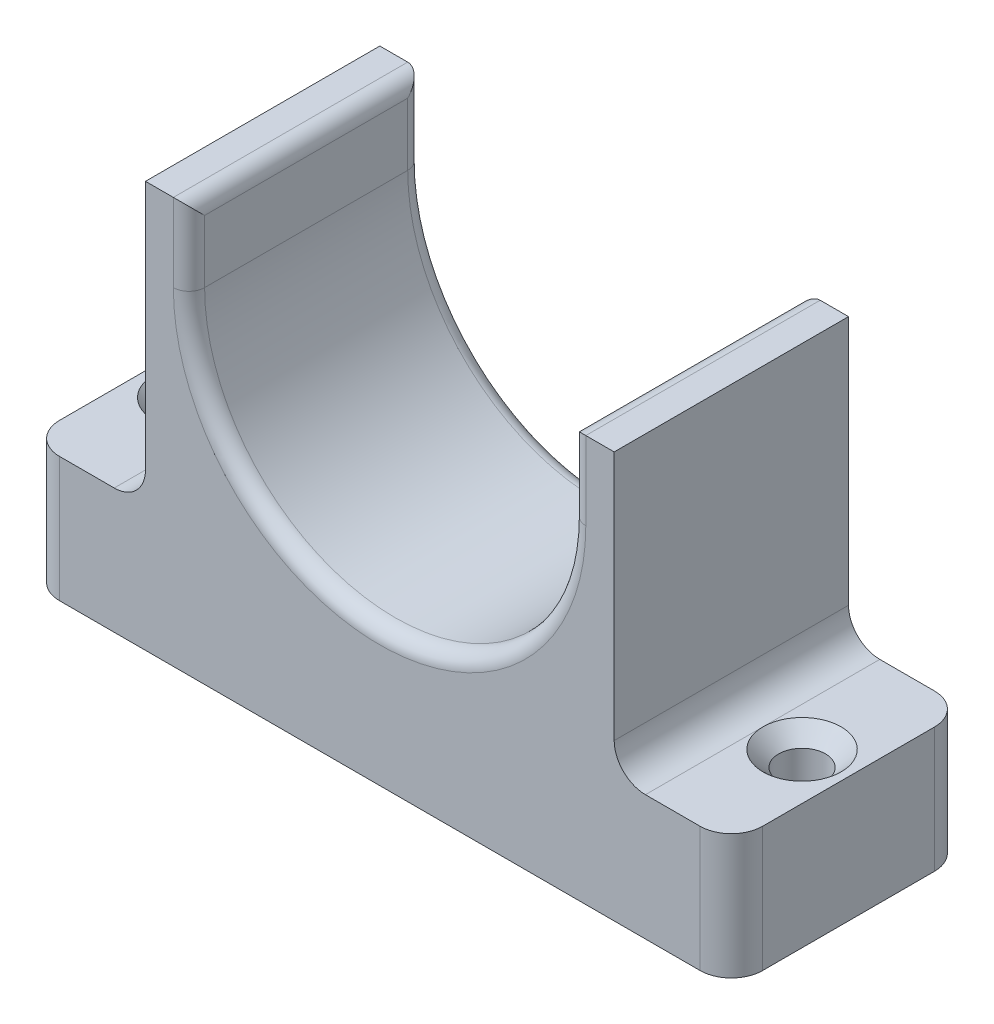
ISO-10303-21;
HEADER;
FILE_DESCRIPTION(('STEP AP214'),'2;1');
FILE_NAME('part.step','',(''),(''),'','','');
FILE_SCHEMA(('AUTOMOTIVE_DESIGN { 1 0 10303 214 1 1 1 1 }'));
ENDSEC;
DATA;
#1=APPLICATION_CONTEXT('core data for automotive mechanical design processes');
#2=APPLICATION_PROTOCOL_DEFINITION('international standard','automotive_design',2000,#1);
#3=PRODUCT_CONTEXT('',#1,'mechanical');
#4=PRODUCT('Part','Part','',(#3));
#5=PRODUCT_RELATED_PRODUCT_CATEGORY('part','',(#4));
#6=PRODUCT_DEFINITION_FORMATION('','',#4);
#7=PRODUCT_DEFINITION_CONTEXT('part definition',#1,'design');
#8=PRODUCT_DEFINITION('design','',#6,#7);
#9=PRODUCT_DEFINITION_SHAPE('','',#8);
#10=(LENGTH_UNIT() NAMED_UNIT(*) SI_UNIT(.MILLI.,.METRE.));
#11=(NAMED_UNIT(*) PLANE_ANGLE_UNIT() SI_UNIT($,.RADIAN.));
#12=(NAMED_UNIT(*) SI_UNIT($,.STERADIAN.) SOLID_ANGLE_UNIT());
#13=UNCERTAINTY_MEASURE_WITH_UNIT(LENGTH_MEASURE(1.E-05),#10,'distance_accuracy_value','');
#14=(GEOMETRIC_REPRESENTATION_CONTEXT(3) GLOBAL_UNCERTAINTY_ASSIGNED_CONTEXT((#13)) GLOBAL_UNIT_ASSIGNED_CONTEXT((#10,
#11,#12)) REPRESENTATION_CONTEXT('',''));
#15=CARTESIAN_POINT('',(0.,0.,0.));
#16=DIRECTION('',(0.,0.,1.));
#17=DIRECTION('',(1.,0.,0.));
#18=AXIS2_PLACEMENT_3D('',#15,#16,#17);
#19=CARTESIAN_POINT('',(0.,26.,0.));
#20=DIRECTION('',(0.,1.,0.));
#21=DIRECTION('',(0.,0.,1.));
#22=AXIS2_PLACEMENT_3D('',#19,#20,#21);
#23=PLANE('',#22);
#24=DIRECTION('',(1.,0.,0.));
#25=VECTOR('',#24,1.);
#26=CARTESIAN_POINT('',(7.5,26.,0.));
#27=LINE('',#26,#25);
#28=CARTESIAN_POINT('',(7.5,26.,0.));
#29=VERTEX_POINT('',#28);
#30=CARTESIAN_POINT('',(9.28490352856837,26.,0.));
#31=VERTEX_POINT('',#30);
#32=EDGE_CURVE('E408',#29,#31,#27,.T.);
#33=ORIENTED_EDGE('',*,*,#32,.T.);
#34=DIRECTION('',(0.,0.,1.));
#35=VECTOR('',#34,1.);
#36=CARTESIAN_POINT('',(9.28490352856837,26.,-15.));
#37=LINE('',#36,#35);
#38=CARTESIAN_POINT('',(9.28490352856837,26.,-15.));
#39=VERTEX_POINT('',#38);
#40=EDGE_CURVE('E11',#31,#39,#37,.F.);
#41=ORIENTED_EDGE('',*,*,#40,.T.);
#42=DIRECTION('',(-1.,0.,0.));
#43=VECTOR('',#42,1.);
#44=CARTESIAN_POINT('',(37.5,26.,-15.));
#45=LINE('',#44,#43);
#46=CARTESIAN_POINT('',(7.5,26.,-15.));
#47=VERTEX_POINT('',#46);
#48=EDGE_CURVE('E193',#39,#47,#45,.T.);
#49=ORIENTED_EDGE('',*,*,#48,.T.);
#50=DIRECTION('',(0.,0.,1.));
#51=VECTOR('',#50,1.);
#52=CARTESIAN_POINT('',(7.5,26.,-15.));
#53=LINE('',#52,#51);
#54=EDGE_CURVE('E196',#47,#29,#53,.T.);
#55=ORIENTED_EDGE('',*,*,#54,.T.);
#56=EDGE_LOOP('',(#33,#41,#49,#55));
#57=FACE_BOUND('',#56,.T.);
#58=ADVANCED_FACE('F39',(#57),#23,.T.);
#59=CARTESIAN_POINT('',(0.,8.,0.));
#60=DIRECTION('',(0.,-1.,0.));
#61=DIRECTION('',(0.,0.,-1.));
#62=AXIS2_PLACEMENT_3D('',#59,#60,#61);
#63=PLANE('',#62);
#64=DIRECTION('',(0.,0.,-1.));
#65=VECTOR('',#64,1.);
#66=CARTESIAN_POINT('',(39.5,8.,0.));
#67=LINE('',#66,#65);
#68=CARTESIAN_POINT('',(39.5,8.,-15.));
#69=VERTEX_POINT('',#68);
#70=CARTESIAN_POINT('',(39.5,8.,-7.52482662311037));
#71=VERTEX_POINT('',#70);
#72=EDGE_CURVE('E259',#69,#71,#67,.F.);
#73=ORIENTED_EDGE('',*,*,#72,.T.);
#74=CARTESIAN_POINT('',(42.,8.,-7.52482662311037));
#75=DIRECTION('',(0.,-1.,0.));
#76=DIRECTION('',(0.,0.,-1.));
#77=AXIS2_PLACEMENT_3D('',#74,#75,#76);
#78=CIRCLE('',#77,2.50000000000002);
#79=EDGE_CURVE('E315',#71,#71,#78,.T.);
#80=ORIENTED_EDGE('',*,*,#79,.T.);
#81=CARTESIAN_POINT('',(39.5,8.,0.));
#82=VERTEX_POINT('',#81);
#83=EDGE_CURVE('E258',#71,#82,#67,.F.);
#84=ORIENTED_EDGE('',*,*,#83,.T.);
#85=DIRECTION('',(1.,0.,0.));
#86=VECTOR('',#85,1.);
#87=CARTESIAN_POINT('',(45.,8.,0.));
#88=LINE('',#87,#86);
#89=CARTESIAN_POINT('',(43.,8.,0.));
#90=VERTEX_POINT('',#89);
#91=EDGE_CURVE('E233',#82,#90,#88,.T.);
#92=ORIENTED_EDGE('',*,*,#91,.T.);
#93=CARTESIAN_POINT('',(43.,8.,-2.));
#94=DIRECTION('',(0.,-1.,0.));
#95=DIRECTION('',(0.,0.,-1.));
#96=AXIS2_PLACEMENT_3D('',#93,#94,#95);
#97=CIRCLE('',#96,2.);
#98=CARTESIAN_POINT('',(45.,8.,-2.));
#99=VERTEX_POINT('',#98);
#100=EDGE_CURVE('E254',#90,#99,#97,.F.);
#101=ORIENTED_EDGE('',*,*,#100,.T.);
#102=DIRECTION('',(0.,0.,-1.));
#103=VECTOR('',#102,1.);
#104=CARTESIAN_POINT('',(45.,8.,-15.));
#105=LINE('',#104,#103);
#106=CARTESIAN_POINT('',(45.,8.,-13.));
#107=VERTEX_POINT('',#106);
#108=EDGE_CURVE('E232',#99,#107,#105,.T.);
#109=ORIENTED_EDGE('',*,*,#108,.T.);
#110=CARTESIAN_POINT('',(43.,8.,-13.));
#111=DIRECTION('',(0.,-1.,0.));
#112=DIRECTION('',(0.,0.,-1.));
#113=AXIS2_PLACEMENT_3D('',#110,#111,#112);
#114=CIRCLE('',#113,2.);
#115=CARTESIAN_POINT('',(43.,8.,-15.));
#116=VERTEX_POINT('',#115);
#117=EDGE_CURVE('E256',#107,#116,#114,.F.);
#118=ORIENTED_EDGE('',*,*,#117,.T.);
#119=DIRECTION('',(-1.,0.,0.));
#120=VECTOR('',#119,1.);
#121=CARTESIAN_POINT('',(0.,8.,-15.));
#122=LINE('',#121,#120);
#123=EDGE_CURVE('E239',#116,#69,#122,.T.);
#124=ORIENTED_EDGE('',*,*,#123,.T.);
#125=EDGE_LOOP('',(#73,#80,#84,#92,#101,#109,#118,#124));
#126=FACE_BOUND('',#125,.T.);
#127=ADVANCED_FACE('F437',(#126),#63,.F.);
#128=DIRECTION('',(0.,0.,1.));
#129=VECTOR('',#128,1.);
#130=CARTESIAN_POINT('',(5.5,8.,-15.));
#131=LINE('',#130,#129);
#132=CARTESIAN_POINT('',(5.50000000000002,8.,0.));
#133=VERTEX_POINT('',#132);
#134=CARTESIAN_POINT('',(5.5,8.,-7.52482662311037));
#135=VERTEX_POINT('',#134);
#136=EDGE_CURVE('E291',#133,#135,#131,.F.);
#137=ORIENTED_EDGE('',*,*,#136,.T.);
#138=CARTESIAN_POINT('',(3.,8.,-7.52482662311037));
#139=DIRECTION('',(0.,-1.,0.));
#140=DIRECTION('',(0.,0.,-1.));
#141=AXIS2_PLACEMENT_3D('',#138,#139,#140);
#142=CIRCLE('',#141,2.50000000000002);
#143=EDGE_CURVE('E321',#135,#135,#142,.T.);
#144=ORIENTED_EDGE('',*,*,#143,.T.);
#145=CARTESIAN_POINT('',(5.5,8.,-15.));
#146=VERTEX_POINT('',#145);
#147=EDGE_CURVE('E290',#135,#146,#131,.F.);
#148=ORIENTED_EDGE('',*,*,#147,.T.);
#149=CARTESIAN_POINT('',(2.,8.,-15.));
#150=VERTEX_POINT('',#149);
#151=EDGE_CURVE('E236',#146,#150,#122,.T.);
#152=ORIENTED_EDGE('',*,*,#151,.T.);
#153=CARTESIAN_POINT('',(2.,8.,-13.));
#154=DIRECTION('',(0.,-1.,0.));
#155=DIRECTION('',(0.,0.,-1.));
#156=AXIS2_PLACEMENT_3D('',#153,#154,#155);
#157=CIRCLE('',#156,2.);
#158=CARTESIAN_POINT('',(0.,8.,-13.));
#159=VERTEX_POINT('',#158);
#160=EDGE_CURVE('E296',#150,#159,#157,.F.);
#161=ORIENTED_EDGE('',*,*,#160,.T.);
#162=DIRECTION('',(0.,0.,1.));
#163=VECTOR('',#162,1.);
#164=CARTESIAN_POINT('',(0.,8.,0.));
#165=LINE('',#164,#163);
#166=CARTESIAN_POINT('',(0.,8.,-2.));
#167=VERTEX_POINT('',#166);
#168=EDGE_CURVE('E240',#159,#167,#165,.T.);
#169=ORIENTED_EDGE('',*,*,#168,.T.);
#170=CARTESIAN_POINT('',(2.,8.,-2.));
#171=DIRECTION('',(0.,-1.,0.));
#172=DIRECTION('',(0.,0.,-1.));
#173=AXIS2_PLACEMENT_3D('',#170,#171,#172);
#174=CIRCLE('',#173,2.);
#175=CARTESIAN_POINT('',(2.00000000000002,8.,0.));
#176=VERTEX_POINT('',#175);
#177=EDGE_CURVE('E294',#167,#176,#174,.F.);
#178=ORIENTED_EDGE('',*,*,#177,.T.);
#179=EDGE_CURVE('E229',#176,#133,#88,.T.);
#180=ORIENTED_EDGE('',*,*,#179,.T.);
#181=EDGE_LOOP('',(#137,#144,#148,#152,#161,#169,#178,#180));
#182=FACE_BOUND('',#181,.T.);
#183=ADVANCED_FACE('F442',(#182),#63,.F.);
#184=CARTESIAN_POINT('',(45.,8.,0.));
#185=DIRECTION('',(0.,0.,-1.));
#186=DIRECTION('',(-1.,0.,0.));
#187=AXIS2_PLACEMENT_3D('',#184,#185,#186);
#188=PLANE('',#187);
#189=CARTESIAN_POINT('',(35.6849035285684,26.,0.));
#190=VERTEX_POINT('',#189);
#191=CARTESIAN_POINT('',(37.5,26.,0.));
#192=VERTEX_POINT('',#191);
#193=EDGE_CURVE('E214',#190,#192,#27,.T.);
#194=ORIENTED_EDGE('',*,*,#193,.F.);
#195=DIRECTION('',(0.,1.,0.));
#196=VECTOR('',#195,1.);
#197=CARTESIAN_POINT('',(35.6849035285684,8.,0.));
#198=LINE('',#197,#196);
#199=CARTESIAN_POINT('',(35.6849035285684,21.,0.));
#200=VERTEX_POINT('',#199);
#201=EDGE_CURVE('E341',#190,#200,#198,.F.);
#202=ORIENTED_EDGE('',*,*,#201,.T.);
#203=CARTESIAN_POINT('',(22.4849035285684,21.,0.));
#204=DIRECTION('',(0.,0.,-1.));
#205=DIRECTION('',(-1.,0.,0.));
#206=AXIS2_PLACEMENT_3D('',#203,#204,#205);
#207=CIRCLE('',#206,13.2);
#208=CARTESIAN_POINT('',(9.28490352856836,20.9999999999999,0.));
#209=VERTEX_POINT('',#208);
#210=EDGE_CURVE('E339',#200,#209,#207,.T.);
#211=ORIENTED_EDGE('',*,*,#210,.T.);
#212=DIRECTION('',(0.,-1.,0.));
#213=VECTOR('',#212,1.);
#214=CARTESIAN_POINT('',(9.28490352856833,8.00000000000009,0.));
#215=LINE('',#214,#213);
#216=EDGE_CURVE('E337',#209,#31,#215,.F.);
#217=ORIENTED_EDGE('',*,*,#216,.T.);
#218=ORIENTED_EDGE('',*,*,#32,.F.);
#219=DIRECTION('',(0.,-1.,0.));
#220=VECTOR('',#219,1.);
#221=CARTESIAN_POINT('',(7.5,26.,0.));
#222=LINE('',#221,#220);
#223=CARTESIAN_POINT('',(7.5,10.,0.));
#224=VERTEX_POINT('',#223);
#225=EDGE_CURVE('E212',#29,#224,#222,.T.);
#226=ORIENTED_EDGE('',*,*,#225,.T.);
#227=CARTESIAN_POINT('',(5.5,10.,0.));
#228=DIRECTION('',(0.,0.,-1.));
#229=DIRECTION('',(-1.,0.,0.));
#230=AXIS2_PLACEMENT_3D('',#227,#228,#229);
#231=CIRCLE('',#230,2.);
#232=EDGE_CURVE('E304',#224,#133,#231,.T.);
#233=ORIENTED_EDGE('',*,*,#232,.T.);
#234=ORIENTED_EDGE('',*,*,#179,.F.);
#235=DIRECTION('',(0.,-1.,0.));
#236=VECTOR('',#235,1.);
#237=CARTESIAN_POINT('',(2.,8.,0.));
#238=LINE('',#237,#236);
#239=CARTESIAN_POINT('',(2.00000000000002,0.,0.));
#240=VERTEX_POINT('',#239);
#241=EDGE_CURVE('E280',#176,#240,#238,.T.);
#242=ORIENTED_EDGE('',*,*,#241,.T.);
#243=DIRECTION('',(1.,0.,0.));
#244=VECTOR('',#243,1.);
#245=CARTESIAN_POINT('',(45.,0.,0.));
#246=LINE('',#245,#244);
#247=CARTESIAN_POINT('',(43.,0.,0.));
#248=VERTEX_POINT('',#247);
#249=EDGE_CURVE('E220',#240,#248,#246,.T.);
#250=ORIENTED_EDGE('',*,*,#249,.T.);
#251=DIRECTION('',(0.,-1.,0.));
#252=VECTOR('',#251,1.);
#253=CARTESIAN_POINT('',(43.,8.,0.));
#254=LINE('',#253,#252);
#255=EDGE_CURVE('E283',#248,#90,#254,.F.);
#256=ORIENTED_EDGE('',*,*,#255,.T.);
#257=ORIENTED_EDGE('',*,*,#91,.F.);
#258=CARTESIAN_POINT('',(39.5,10.,0.));
#259=DIRECTION('',(0.,0.,-1.));
#260=DIRECTION('',(-1.,0.,0.));
#261=AXIS2_PLACEMENT_3D('',#258,#259,#260);
#262=CIRCLE('',#261,2.);
#263=CARTESIAN_POINT('',(37.5,10.,0.));
#264=VERTEX_POINT('',#263);
#265=EDGE_CURVE('E302',#82,#264,#262,.T.);
#266=ORIENTED_EDGE('',*,*,#265,.T.);
#267=DIRECTION('',(0.,-1.,0.));
#268=VECTOR('',#267,1.);
#269=CARTESIAN_POINT('',(37.5,26.,0.));
#270=LINE('',#269,#268);
#271=EDGE_CURVE('E225',#192,#264,#270,.T.);
#272=ORIENTED_EDGE('',*,*,#271,.F.);
#273=EDGE_LOOP('',(#194,#202,#211,#217,#218,#226,#233,#234,#242,#250,#256,#257,#266,#272));
#274=FACE_BOUND('',#273,.T.);
#275=ADVANCED_FACE('F405',(#274),#188,.F.);
#276=CARTESIAN_POINT('',(45.,8.,-15.));
#277=DIRECTION('',(-1.,0.,0.));
#278=DIRECTION('',(0.,0.,1.));
#279=AXIS2_PLACEMENT_3D('',#276,#277,#278);
#280=PLANE('',#279);
#281=DIRECTION('',(0.,0.,-1.));
#282=VECTOR('',#281,1.);
#283=CARTESIAN_POINT('',(45.,0.,-15.));
#284=LINE('',#283,#282);
#285=CARTESIAN_POINT('',(45.,0.,-2.));
#286=VERTEX_POINT('',#285);
#287=CARTESIAN_POINT('',(45.,0.,-13.));
#288=VERTEX_POINT('',#287);
#289=EDGE_CURVE('E223',#286,#288,#284,.T.);
#290=ORIENTED_EDGE('',*,*,#289,.T.);
#291=DIRECTION('',(0.,-1.,0.));
#292=VECTOR('',#291,1.);
#293=CARTESIAN_POINT('',(45.,8.,-13.));
#294=LINE('',#293,#292);
#295=EDGE_CURVE('E278',#288,#107,#294,.F.);
#296=ORIENTED_EDGE('',*,*,#295,.T.);
#297=ORIENTED_EDGE('',*,*,#108,.F.);
#298=DIRECTION('',(0.,-1.,0.));
#299=VECTOR('',#298,1.);
#300=CARTESIAN_POINT('',(45.,8.,-2.));
#301=LINE('',#300,#299);
#302=EDGE_CURVE('E275',#99,#286,#301,.T.);
#303=ORIENTED_EDGE('',*,*,#302,.T.);
#304=EDGE_LOOP('',(#290,#296,#297,#303));
#305=FACE_BOUND('',#304,.T.);
#306=ADVANCED_FACE('F473',(#305),#280,.F.);
#307=CARTESIAN_POINT('',(0.,8.,-15.));
#308=DIRECTION('',(0.,0.,1.));
#309=DIRECTION('',(1.,0.,0.));
#310=AXIS2_PLACEMENT_3D('',#307,#308,#309);
#311=PLANE('',#310);
#312=CARTESIAN_POINT('',(22.4849035285684,21.,-15.));
#313=DIRECTION('',(0.,0.,1.));
#314=DIRECTION('',(1.,0.,0.));
#315=AXIS2_PLACEMENT_3D('',#312,#313,#314);
#316=CIRCLE('',#315,13.2);
#317=CARTESIAN_POINT('',(9.28490352856836,20.9999999999999,-15.));
#318=VERTEX_POINT('',#317);
#319=CARTESIAN_POINT('',(35.6849035285684,21.,-15.));
#320=VERTEX_POINT('',#319);
#321=EDGE_CURVE('E348',#318,#320,#316,.T.);
#322=ORIENTED_EDGE('',*,*,#321,.T.);
#323=DIRECTION('',(0.,1.,0.));
#324=VECTOR('',#323,1.);
#325=CARTESIAN_POINT('',(35.6849035285684,8.,-15.));
#326=LINE('',#325,#324);
#327=CARTESIAN_POINT('',(35.6849035285684,26.,-15.));
#328=VERTEX_POINT('',#327);
#329=EDGE_CURVE('E350',#320,#328,#326,.T.);
#330=ORIENTED_EDGE('',*,*,#329,.T.);
#331=CARTESIAN_POINT('',(37.5,26.,-15.));
#332=VERTEX_POINT('',#331);
#333=EDGE_CURVE('E202',#332,#328,#45,.T.);
#334=ORIENTED_EDGE('',*,*,#333,.F.);
#335=DIRECTION('',(0.,-1.,0.));
#336=VECTOR('',#335,1.);
#337=CARTESIAN_POINT('',(37.5,26.,-15.));
#338=LINE('',#337,#336);
#339=CARTESIAN_POINT('',(37.5,10.,-15.));
#340=VERTEX_POINT('',#339);
#341=EDGE_CURVE('E790',#332,#340,#338,.T.);
#342=ORIENTED_EDGE('',*,*,#341,.T.);
#343=CARTESIAN_POINT('',(39.5,10.,-15.));
#344=DIRECTION('',(0.,0.,1.));
#345=DIRECTION('',(1.,0.,0.));
#346=AXIS2_PLACEMENT_3D('',#343,#344,#345);
#347=CIRCLE('',#346,2.);
#348=EDGE_CURVE('E300',#340,#69,#347,.T.);
#349=ORIENTED_EDGE('',*,*,#348,.T.);
#350=ORIENTED_EDGE('',*,*,#123,.F.);
#351=DIRECTION('',(0.,-1.,0.));
#352=VECTOR('',#351,1.);
#353=CARTESIAN_POINT('',(43.,8.,-15.));
#354=LINE('',#353,#352);
#355=CARTESIAN_POINT('',(43.,0.,-15.));
#356=VERTEX_POINT('',#355);
#357=EDGE_CURVE('E264',#116,#356,#354,.T.);
#358=ORIENTED_EDGE('',*,*,#357,.T.);
#359=DIRECTION('',(-1.,0.,0.));
#360=VECTOR('',#359,1.);
#361=CARTESIAN_POINT('',(0.,0.,-15.));
#362=LINE('',#361,#360);
#363=CARTESIAN_POINT('',(2.,0.,-15.));
#364=VERTEX_POINT('',#363);
#365=EDGE_CURVE('E246',#356,#364,#362,.T.);
#366=ORIENTED_EDGE('',*,*,#365,.T.);
#367=DIRECTION('',(0.,-1.,0.));
#368=VECTOR('',#367,1.);
#369=CARTESIAN_POINT('',(2.,8.,-15.));
#370=LINE('',#369,#368);
#371=EDGE_CURVE('E262',#364,#150,#370,.F.);
#372=ORIENTED_EDGE('',*,*,#371,.T.);
#373=ORIENTED_EDGE('',*,*,#151,.F.);
#374=CARTESIAN_POINT('',(5.5,10.,-15.));
#375=DIRECTION('',(0.,0.,1.));
#376=DIRECTION('',(1.,0.,0.));
#377=AXIS2_PLACEMENT_3D('',#374,#375,#376);
#378=CIRCLE('',#377,2.);
#379=CARTESIAN_POINT('',(7.5,10.,-15.));
#380=VERTEX_POINT('',#379);
#381=EDGE_CURVE('E219',#146,#380,#378,.T.);
#382=ORIENTED_EDGE('',*,*,#381,.T.);
#383=DIRECTION('',(0.,-1.,0.));
#384=VECTOR('',#383,1.);
#385=CARTESIAN_POINT('',(7.5,26.,-15.));
#386=LINE('',#385,#384);
#387=EDGE_CURVE('E209',#47,#380,#386,.T.);
#388=ORIENTED_EDGE('',*,*,#387,.F.);
#389=ORIENTED_EDGE('',*,*,#48,.F.);
#390=DIRECTION('',(0.,-1.,0.));
#391=VECTOR('',#390,1.);
#392=CARTESIAN_POINT('',(9.28490352856833,7.99999999999998,-15.));
#393=LINE('',#392,#391);
#394=EDGE_CURVE('E346',#39,#318,#393,.T.);
#395=ORIENTED_EDGE('',*,*,#394,.T.);
#396=EDGE_LOOP('',(#322,#330,#334,#342,#349,#350,#358,#366,#372,#373,#382,#388,#389,#395));
#397=FACE_BOUND('',#396,.T.);
#398=ADVANCED_FACE('F216',(#397),#311,.F.);
#399=CARTESIAN_POINT('',(0.,8.,0.));
#400=DIRECTION('',(1.,0.,0.));
#401=DIRECTION('',(0.,0.,-1.));
#402=AXIS2_PLACEMENT_3D('',#399,#400,#401);
#403=PLANE('',#402);
#404=ORIENTED_EDGE('',*,*,#168,.F.);
#405=DIRECTION('',(0.,-1.,0.));
#406=VECTOR('',#405,1.);
#407=CARTESIAN_POINT('',(0.,8.,-13.));
#408=LINE('',#407,#406);
#409=CARTESIAN_POINT('',(0.,0.,-13.));
#410=VERTEX_POINT('',#409);
#411=EDGE_CURVE('E287',#159,#410,#408,.T.);
#412=ORIENTED_EDGE('',*,*,#411,.T.);
#413=DIRECTION('',(0.,0.,1.));
#414=VECTOR('',#413,1.);
#415=CARTESIAN_POINT('',(0.,0.,0.));
#416=LINE('',#415,#414);
#417=CARTESIAN_POINT('',(0.,0.,-2.));
#418=VERTEX_POINT('',#417);
#419=EDGE_CURVE('E249',#410,#418,#416,.T.);
#420=ORIENTED_EDGE('',*,*,#419,.T.);
#421=DIRECTION('',(0.,-1.,0.));
#422=VECTOR('',#421,1.);
#423=CARTESIAN_POINT('',(0.,8.,-2.));
#424=LINE('',#423,#422);
#425=EDGE_CURVE('E285',#418,#167,#424,.F.);
#426=ORIENTED_EDGE('',*,*,#425,.T.);
#427=EDGE_LOOP('',(#404,#412,#420,#426));
#428=FACE_BOUND('',#427,.T.);
#429=ADVANCED_FACE('F466',(#428),#403,.F.);
#430=CARTESIAN_POINT('',(0.,0.,0.));
#431=DIRECTION('',(0.,-1.,0.));
#432=DIRECTION('',(0.,0.,-1.));
#433=AXIS2_PLACEMENT_3D('',#430,#431,#432);
#434=PLANE('',#433);
#435=CARTESIAN_POINT('',(3.,0.,-7.52482662311037));
#436=DIRECTION('',(0.,-1.,0.));
#437=DIRECTION('',(0.,0.,-1.));
#438=AXIS2_PLACEMENT_3D('',#435,#436,#437);
#439=CIRCLE('',#438,1.5);
#440=CARTESIAN_POINT('',(3.,0.,-9.02482662311037));
#441=VERTEX_POINT('',#440);
#442=EDGE_CURVE('E203',#441,#441,#439,.T.);
#443=ORIENTED_EDGE('',*,*,#442,.F.);
#444=EDGE_LOOP('',(#443));
#445=FACE_BOUND('',#444,.T.);
#446=CARTESIAN_POINT('',(42.,0.,-7.52482662311037));
#447=DIRECTION('',(0.,-1.,0.));
#448=DIRECTION('',(0.,0.,-1.));
#449=AXIS2_PLACEMENT_3D('',#446,#447,#448);
#450=CIRCLE('',#449,1.5);
#451=CARTESIAN_POINT('',(42.,0.,-9.02482662311037));
#452=VERTEX_POINT('',#451);
#453=EDGE_CURVE('E308',#452,#452,#450,.T.);
#454=ORIENTED_EDGE('',*,*,#453,.F.);
#455=EDGE_LOOP('',(#454));
#456=FACE_BOUND('',#455,.T.);
#457=ORIENTED_EDGE('',*,*,#365,.F.);
#458=CARTESIAN_POINT('',(43.,0.,-13.));
#459=DIRECTION('',(0.,-1.,0.));
#460=DIRECTION('',(0.,0.,-1.));
#461=AXIS2_PLACEMENT_3D('',#458,#459,#460);
#462=CIRCLE('',#461,2.);
#463=EDGE_CURVE('E273',#356,#288,#462,.T.);
#464=ORIENTED_EDGE('',*,*,#463,.T.);
#465=ORIENTED_EDGE('',*,*,#289,.F.);
#466=CARTESIAN_POINT('',(43.,0.,-2.));
#467=DIRECTION('',(0.,-1.,0.));
#468=DIRECTION('',(0.,0.,-1.));
#469=AXIS2_PLACEMENT_3D('',#466,#467,#468);
#470=CIRCLE('',#469,2.);
#471=EDGE_CURVE('E271',#286,#248,#470,.T.);
#472=ORIENTED_EDGE('',*,*,#471,.T.);
#473=ORIENTED_EDGE('',*,*,#249,.F.);
#474=CARTESIAN_POINT('',(2.,0.,-2.));
#475=DIRECTION('',(0.,-1.,0.));
#476=DIRECTION('',(0.,0.,-1.));
#477=AXIS2_PLACEMENT_3D('',#474,#475,#476);
#478=CIRCLE('',#477,2.);
#479=EDGE_CURVE('E267',#240,#418,#478,.T.);
#480=ORIENTED_EDGE('',*,*,#479,.T.);
#481=ORIENTED_EDGE('',*,*,#419,.F.);
#482=CARTESIAN_POINT('',(2.,0.,-13.));
#483=DIRECTION('',(0.,-1.,0.));
#484=DIRECTION('',(0.,0.,-1.));
#485=AXIS2_PLACEMENT_3D('',#482,#483,#484);
#486=CIRCLE('',#485,2.);
#487=EDGE_CURVE('E269',#410,#364,#486,.T.);
#488=ORIENTED_EDGE('',*,*,#487,.T.);
#489=EDGE_LOOP('',(#457,#464,#465,#472,#473,#480,#481,#488));
#490=FACE_BOUND('',#489,.T.);
#491=ADVANCED_FACE('F461',(#445,#456,#490),#434,.T.);
#492=CARTESIAN_POINT('',(7.5,26.,-15.));
#493=DIRECTION('',(1.,0.,0.));
#494=DIRECTION('',(0.,0.,-1.));
#495=AXIS2_PLACEMENT_3D('',#492,#493,#494);
#496=PLANE('',#495);
#497=ORIENTED_EDGE('',*,*,#387,.T.);
#498=DIRECTION('',(0.,0.,1.));
#499=VECTOR('',#498,1.);
#500=CARTESIAN_POINT('',(7.5,10.,0.));
#501=LINE('',#500,#499);
#502=EDGE_CURVE('E298',#380,#224,#501,.T.);
#503=ORIENTED_EDGE('',*,*,#502,.T.);
#504=ORIENTED_EDGE('',*,*,#225,.F.);
#505=ORIENTED_EDGE('',*,*,#54,.F.);
#506=EDGE_LOOP('',(#497,#503,#504,#505));
#507=FACE_BOUND('',#506,.T.);
#508=ADVANCED_FACE('F207',(#507),#496,.F.);
#509=CARTESIAN_POINT('',(37.5,26.,0.));
#510=DIRECTION('',(-1.,0.,0.));
#511=DIRECTION('',(0.,0.,1.));
#512=AXIS2_PLACEMENT_3D('',#509,#510,#511);
#513=PLANE('',#512);
#514=ORIENTED_EDGE('',*,*,#271,.T.);
#515=DIRECTION('',(0.,0.,-1.));
#516=VECTOR('',#515,1.);
#517=CARTESIAN_POINT('',(37.5,10.,-15.));
#518=LINE('',#517,#516);
#519=EDGE_CURVE('E242',#264,#340,#518,.T.);
#520=ORIENTED_EDGE('',*,*,#519,.T.);
#521=ORIENTED_EDGE('',*,*,#341,.F.);
#522=DIRECTION('',(0.,0.,-1.));
#523=VECTOR('',#522,1.);
#524=CARTESIAN_POINT('',(37.5,26.,0.));
#525=LINE('',#524,#523);
#526=EDGE_CURVE('E789',#192,#332,#525,.T.);
#527=ORIENTED_EDGE('',*,*,#526,.F.);
#528=EDGE_LOOP('',(#514,#520,#521,#527));
#529=FACE_BOUND('',#528,.T.);
#530=ADVANCED_FACE('F449',(#529),#513,.F.);
#531=ORIENTED_EDGE('',*,*,#333,.T.);
#532=DIRECTION('',(0.,0.,1.));
#533=VECTOR('',#532,1.);
#534=CARTESIAN_POINT('',(35.6849035285684,26.,0.));
#535=LINE('',#534,#533);
#536=EDGE_CURVE('E344',#328,#190,#535,.T.);
#537=ORIENTED_EDGE('',*,*,#536,.T.);
#538=ORIENTED_EDGE('',*,*,#193,.T.);
#539=ORIENTED_EDGE('',*,*,#526,.T.);
#540=EDGE_LOOP('',(#531,#537,#538,#539));
#541=FACE_BOUND('',#540,.T.);
#542=ADVANCED_FACE('F401',(#541),#23,.T.);
#543=CARTESIAN_POINT('',(39.5,10.,0.));
#544=DIRECTION('',(0.,0.,1.));
#545=DIRECTION('',(1.,0.,0.));
#546=AXIS2_PLACEMENT_3D('',#543,#544,#545);
#547=CYLINDRICAL_SURFACE('',#546,2.);
#548=ORIENTED_EDGE('',*,*,#265,.F.);
#549=ORIENTED_EDGE('',*,*,#83,.F.);
#550=ORIENTED_EDGE('',*,*,#72,.F.);
#551=ORIENTED_EDGE('',*,*,#348,.F.);
#552=ORIENTED_EDGE('',*,*,#519,.F.);
#553=EDGE_LOOP('',(#548,#549,#550,#551,#552));
#554=FACE_BOUND('',#553,.T.);
#555=ADVANCED_FACE('F448',(#554),#547,.F.);
#556=CARTESIAN_POINT('',(43.,8.,-13.));
#557=DIRECTION('',(0.,-1.,0.));
#558=DIRECTION('',(0.,0.,-1.));
#559=AXIS2_PLACEMENT_3D('',#556,#557,#558);
#560=CYLINDRICAL_SURFACE('',#559,2.);
#561=ORIENTED_EDGE('',*,*,#117,.F.);
#562=ORIENTED_EDGE('',*,*,#295,.F.);
#563=ORIENTED_EDGE('',*,*,#463,.F.);
#564=ORIENTED_EDGE('',*,*,#357,.F.);
#565=EDGE_LOOP('',(#561,#562,#563,#564));
#566=FACE_BOUND('',#565,.T.);
#567=ADVANCED_FACE('F454',(#566),#560,.T.);
#568=CARTESIAN_POINT('',(43.,8.,-2.));
#569=DIRECTION('',(0.,-1.,0.));
#570=DIRECTION('',(0.,0.,-1.));
#571=AXIS2_PLACEMENT_3D('',#568,#569,#570);
#572=CYLINDRICAL_SURFACE('',#571,2.);
#573=ORIENTED_EDGE('',*,*,#100,.F.);
#574=ORIENTED_EDGE('',*,*,#255,.F.);
#575=ORIENTED_EDGE('',*,*,#471,.F.);
#576=ORIENTED_EDGE('',*,*,#302,.F.);
#577=EDGE_LOOP('',(#573,#574,#575,#576));
#578=FACE_BOUND('',#577,.T.);
#579=ADVANCED_FACE('F481',(#578),#572,.T.);
#580=CARTESIAN_POINT('',(2.,8.,-13.));
#581=DIRECTION('',(0.,-1.,0.));
#582=DIRECTION('',(0.,0.,-1.));
#583=AXIS2_PLACEMENT_3D('',#580,#581,#582);
#584=CYLINDRICAL_SURFACE('',#583,2.);
#585=ORIENTED_EDGE('',*,*,#160,.F.);
#586=ORIENTED_EDGE('',*,*,#371,.F.);
#587=ORIENTED_EDGE('',*,*,#487,.F.);
#588=ORIENTED_EDGE('',*,*,#411,.F.);
#589=EDGE_LOOP('',(#585,#586,#587,#588));
#590=FACE_BOUND('',#589,.T.);
#591=ADVANCED_FACE('F485',(#590),#584,.T.);
#592=CARTESIAN_POINT('',(2.,8.,-2.));
#593=DIRECTION('',(0.,-1.,0.));
#594=DIRECTION('',(0.,0.,-1.));
#595=AXIS2_PLACEMENT_3D('',#592,#593,#594);
#596=CYLINDRICAL_SURFACE('',#595,2.);
#597=ORIENTED_EDGE('',*,*,#177,.F.);
#598=ORIENTED_EDGE('',*,*,#425,.F.);
#599=ORIENTED_EDGE('',*,*,#479,.F.);
#600=ORIENTED_EDGE('',*,*,#241,.F.);
#601=EDGE_LOOP('',(#597,#598,#599,#600));
#602=FACE_BOUND('',#601,.T.);
#603=ADVANCED_FACE('F489',(#602),#596,.T.);
#604=CARTESIAN_POINT('',(5.5,10.,-15.));
#605=DIRECTION('',(0.,0.,-1.));
#606=DIRECTION('',(-1.,0.,0.));
#607=AXIS2_PLACEMENT_3D('',#604,#605,#606);
#608=CYLINDRICAL_SURFACE('',#607,2.);
#609=ORIENTED_EDGE('',*,*,#381,.F.);
#610=ORIENTED_EDGE('',*,*,#147,.F.);
#611=ORIENTED_EDGE('',*,*,#136,.F.);
#612=ORIENTED_EDGE('',*,*,#232,.F.);
#613=ORIENTED_EDGE('',*,*,#502,.F.);
#614=EDGE_LOOP('',(#609,#610,#611,#612,#613));
#615=FACE_BOUND('',#614,.T.);
#616=ADVANCED_FACE('F493',(#615),#608,.F.);
#617=CARTESIAN_POINT('',(42.,-12.,-7.52482662311037));
#618=DIRECTION('',(0.,1.,0.));
#619=DIRECTION('',(0.,0.,1.));
#620=AXIS2_PLACEMENT_3D('',#617,#618,#619);
#621=CYLINDRICAL_SURFACE('',#620,1.5);
#622=CARTESIAN_POINT('',(42.,7.,-7.52482662311037));
#623=DIRECTION('',(0.,-1.,0.));
#624=DIRECTION('',(0.,0.,-1.));
#625=AXIS2_PLACEMENT_3D('',#622,#623,#624);
#626=CIRCLE('',#625,1.5);
#627=CARTESIAN_POINT('',(42.,7.,-9.02482662311037));
#628=VERTEX_POINT('',#627);
#629=EDGE_CURVE('E307',#628,#628,#626,.F.);
#630=ORIENTED_EDGE('',*,*,#629,.T.);
#631=EDGE_LOOP('',(#630));
#632=FACE_BOUND('',#631,.T.);
#633=ORIENTED_EDGE('',*,*,#453,.T.);
#634=EDGE_LOOP('',(#633));
#635=FACE_BOUND('',#634,.T.);
#636=ADVANCED_FACE('F497',(#632,#635),#621,.F.);
#637=CARTESIAN_POINT('',(3.,-12.,-7.52482662311037));
#638=DIRECTION('',(0.,1.,0.));
#639=DIRECTION('',(0.,0.,1.));
#640=AXIS2_PLACEMENT_3D('',#637,#638,#639);
#641=CYLINDRICAL_SURFACE('',#640,1.5);
#642=CARTESIAN_POINT('',(3.,6.99999999999999,-7.52482662311037));
#643=DIRECTION('',(0.,-1.,0.));
#644=DIRECTION('',(0.,0.,-1.));
#645=AXIS2_PLACEMENT_3D('',#642,#643,#644);
#646=CIRCLE('',#645,1.5);
#647=CARTESIAN_POINT('',(3.,6.99999999999999,-9.02482662311037));
#648=VERTEX_POINT('',#647);
#649=EDGE_CURVE('E318',#648,#648,#646,.F.);
#650=ORIENTED_EDGE('',*,*,#649,.T.);
#651=EDGE_LOOP('',(#650));
#652=FACE_BOUND('',#651,.T.);
#653=ORIENTED_EDGE('',*,*,#442,.T.);
#654=EDGE_LOOP('',(#653));
#655=FACE_BOUND('',#654,.T.);
#656=ADVANCED_FACE('F507',(#652,#655),#641,.F.);
#657=CARTESIAN_POINT('',(42.,7.,-7.52482662311037));
#658=DIRECTION('',(0.,1.,0.));
#659=DIRECTION('',(0.,0.,1.));
#660=AXIS2_PLACEMENT_3D('',#657,#658,#659);
#661=CONICAL_SURFACE('',#660,1.5,0.785398163397452);
#662=ORIENTED_EDGE('',*,*,#79,.F.);
#663=EDGE_LOOP('',(#662));
#664=FACE_BOUND('',#663,.T.);
#665=ORIENTED_EDGE('',*,*,#629,.F.);
#666=EDGE_LOOP('',(#665));
#667=FACE_BOUND('',#666,.T.);
#668=ADVANCED_FACE('F500',(#664,#667),#661,.F.);
#669=CARTESIAN_POINT('',(3.,6.99999999999999,-7.52482662311037));
#670=DIRECTION('',(0.,1.,0.));
#671=DIRECTION('',(0.,0.,1.));
#672=AXIS2_PLACEMENT_3D('',#669,#670,#671);
#673=CONICAL_SURFACE('',#672,1.5,0.78539816339745);
#674=ORIENTED_EDGE('',*,*,#143,.F.);
#675=EDGE_LOOP('',(#674));
#676=FACE_BOUND('',#675,.T.);
#677=ORIENTED_EDGE('',*,*,#649,.F.);
#678=EDGE_LOOP('',(#677));
#679=FACE_BOUND('',#678,.T.);
#680=ADVANCED_FACE('F506',(#676,#679),#673,.F.);
#681=CARTESIAN_POINT('',(22.4849035285684,21.,-20.));
#682=DIRECTION('',(0.,0.,1.));
#683=DIRECTION('',(1.,0.,0.));
#684=AXIS2_PLACEMENT_3D('',#681,#682,#683);
#685=CYLINDRICAL_SURFACE('',#684,12.2);
#686=DIRECTION('',(0.,0.,1.));
#687=VECTOR('',#686,1.);
#688=CARTESIAN_POINT('',(34.6849035285684,21.,-20.));
#689=LINE('',#688,#687);
#690=CARTESIAN_POINT('',(34.6849035285684,21.,-1.));
#691=VERTEX_POINT('',#690);
#692=CARTESIAN_POINT('',(34.6849035285684,21.,-14.));
#693=VERTEX_POINT('',#692);
#694=EDGE_CURVE('E327',#691,#693,#689,.F.);
#695=ORIENTED_EDGE('',*,*,#694,.T.);
#696=CARTESIAN_POINT('',(22.4849035285684,21.,-14.));
#697=DIRECTION('',(0.,0.,1.));
#698=DIRECTION('',(1.,0.,0.));
#699=AXIS2_PLACEMENT_3D('',#696,#697,#698);
#700=CIRCLE('',#699,12.2);
#701=CARTESIAN_POINT('',(10.2849035285684,20.9999999999999,-14.));
#702=VERTEX_POINT('',#701);
#703=EDGE_CURVE('E354',#693,#702,#700,.F.);
#704=ORIENTED_EDGE('',*,*,#703,.T.);
#705=DIRECTION('',(0.,0.,1.));
#706=VECTOR('',#705,1.);
#707=CARTESIAN_POINT('',(10.2849035285684,20.9999999999999,-20.));
#708=LINE('',#707,#706);
#709=CARTESIAN_POINT('',(10.2849035285684,20.9999999999999,-1.));
#710=VERTEX_POINT('',#709);
#711=EDGE_CURVE('E324',#702,#710,#708,.T.);
#712=ORIENTED_EDGE('',*,*,#711,.T.);
#713=CARTESIAN_POINT('',(22.4849035285684,21.,-1.));
#714=DIRECTION('',(0.,0.,-1.));
#715=DIRECTION('',(-1.,0.,0.));
#716=AXIS2_PLACEMENT_3D('',#713,#714,#715);
#717=CIRCLE('',#716,12.2);
#718=EDGE_CURVE('E352',#710,#691,#717,.F.);
#719=ORIENTED_EDGE('',*,*,#718,.T.);
#720=EDGE_LOOP('',(#695,#704,#712,#719));
#721=FACE_BOUND('',#720,.T.);
#722=ADVANCED_FACE('F425',(#721),#685,.F.);
#723=CARTESIAN_POINT('',(10.2849035285684,20.9999999999999,-20.));
#724=DIRECTION('',(-1.,0.,0.));
#725=DIRECTION('',(0.,-1.,0.));
#726=AXIS2_PLACEMENT_3D('',#723,#724,#725);
#727=PLANE('',#726);
#728=ORIENTED_EDGE('',*,*,#711,.F.);
#729=DIRECTION('',(0.,-1.,0.));
#730=VECTOR('',#729,1.);
#731=CARTESIAN_POINT('',(10.2849035285684,20.9999999999999,-14.));
#732=LINE('',#731,#730);
#733=CARTESIAN_POINT('',(10.2849035285684,25.,-14.));
#734=VERTEX_POINT('',#733);
#735=EDGE_CURVE('E48',#702,#734,#732,.F.);
#736=ORIENTED_EDGE('',*,*,#735,.T.);
#737=DIRECTION('',(0.,0.,1.));
#738=VECTOR('',#737,1.);
#739=CARTESIAN_POINT('',(10.2849035285684,25.,0.));
#740=LINE('',#739,#738);
#741=CARTESIAN_POINT('',(10.2849035285684,25.,-1.));
#742=VERTEX_POINT('',#741);
#743=EDGE_CURVE('E56',#734,#742,#740,.T.);
#744=ORIENTED_EDGE('',*,*,#743,.T.);
#745=DIRECTION('',(0.,-1.,0.));
#746=VECTOR('',#745,1.);
#747=CARTESIAN_POINT('',(10.2849035285684,20.9999999999999,-1.));
#748=LINE('',#747,#746);
#749=EDGE_CURVE('E357',#742,#710,#748,.T.);
#750=ORIENTED_EDGE('',*,*,#749,.T.);
#751=EDGE_LOOP('',(#728,#736,#744,#750));
#752=FACE_BOUND('',#751,.T.);
#753=ADVANCED_FACE('F423',(#752),#727,.F.);
#754=CARTESIAN_POINT('',(34.6849035285684,21.,-20.));
#755=DIRECTION('',(1.,0.,0.));
#756=DIRECTION('',(0.,0.,-1.));
#757=AXIS2_PLACEMENT_3D('',#754,#755,#756);
#758=PLANE('',#757);
#759=ORIENTED_EDGE('',*,*,#694,.F.);
#760=DIRECTION('',(0.,1.,0.));
#761=VECTOR('',#760,1.);
#762=CARTESIAN_POINT('',(34.6849035285684,21.,-1.));
#763=LINE('',#762,#761);
#764=CARTESIAN_POINT('',(34.6849035285684,25.,-1.));
#765=VERTEX_POINT('',#764);
#766=EDGE_CURVE('E334',#691,#765,#763,.T.);
#767=ORIENTED_EDGE('',*,*,#766,.T.);
#768=DIRECTION('',(0.,0.,1.));
#769=VECTOR('',#768,1.);
#770=CARTESIAN_POINT('',(34.6849035285684,25.,-15.));
#771=LINE('',#770,#769);
#772=CARTESIAN_POINT('',(34.6849035285684,25.,-14.));
#773=VERTEX_POINT('',#772);
#774=EDGE_CURVE('E332',#765,#773,#771,.F.);
#775=ORIENTED_EDGE('',*,*,#774,.T.);
#776=DIRECTION('',(0.,1.,0.));
#777=VECTOR('',#776,1.);
#778=CARTESIAN_POINT('',(34.6849035285684,21.,-14.));
#779=LINE('',#778,#777);
#780=EDGE_CURVE('E330',#773,#693,#779,.F.);
#781=ORIENTED_EDGE('',*,*,#780,.T.);
#782=EDGE_LOOP('',(#759,#767,#775,#781));
#783=FACE_BOUND('',#782,.T.);
#784=ADVANCED_FACE('F428',(#783),#758,.F.);
#785=CARTESIAN_POINT('',(9.28490352856833,7.99999999999998,-14.));
#786=DIRECTION('',(0.,-1.,0.));
#787=DIRECTION('',(1.,0.,0.));
#788=AXIS2_PLACEMENT_3D('',#785,#786,#787);
#789=CYLINDRICAL_SURFACE('',#788,1.);
#790=CARTESIAN_POINT('',(9.28490352856836,20.9999999999999,-14.));
#791=DIRECTION('',(0.,-1.,0.));
#792=DIRECTION('',(1.,0.,0.));
#793=AXIS2_PLACEMENT_3D('',#790,#791,#792);
#794=CIRCLE('',#793,1.);
#795=EDGE_CURVE('E375',#318,#702,#794,.T.);
#796=ORIENTED_EDGE('',*,*,#795,.F.);
#797=ORIENTED_EDGE('',*,*,#394,.F.);
#798=CARTESIAN_POINT('',(9.28490352856837,25.,-14.));
#799=DIRECTION('',(0.,-0.707106781186547,-0.707106781186547));
#800=DIRECTION('',(0.,0.707106781186547,-0.707106781186547));
#801=AXIS2_PLACEMENT_3D('',#798,#799,#800);
#802=ELLIPSE('',#801,1.41421356237309,1.);
#803=EDGE_CURVE('E43',#734,#39,#802,.F.);
#804=ORIENTED_EDGE('',*,*,#803,.F.);
#805=ORIENTED_EDGE('',*,*,#735,.F.);
#806=EDGE_LOOP('',(#796,#797,#804,#805));
#807=FACE_BOUND('',#806,.T.);
#808=ADVANCED_FACE('F41',(#807),#789,.T.);
#809=CARTESIAN_POINT('',(9.28490352856837,25.,-20.));
#810=DIRECTION('',(0.,0.,-1.));
#811=DIRECTION('',(-1.,0.,0.));
#812=AXIS2_PLACEMENT_3D('',#809,#810,#811);
#813=CYLINDRICAL_SURFACE('',#812,1.);
#814=ORIENTED_EDGE('',*,*,#803,.T.);
#815=ORIENTED_EDGE('',*,*,#40,.F.);
#816=CARTESIAN_POINT('',(9.28490352856837,25.,-1.));
#817=DIRECTION('',(0.,0.707106781186547,-0.707106781186547));
#818=DIRECTION('',(0.,-0.707106781186547,-0.707106781186547));
#819=AXIS2_PLACEMENT_3D('',#816,#817,#818);
#820=ELLIPSE('',#819,1.41421356237309,1.);
#821=EDGE_CURVE('E373',#742,#31,#820,.F.);
#822=ORIENTED_EDGE('',*,*,#821,.F.);
#823=ORIENTED_EDGE('',*,*,#743,.F.);
#824=EDGE_LOOP('',(#814,#815,#822,#823));
#825=FACE_BOUND('',#824,.T.);
#826=ADVANCED_FACE('F383',(#825),#813,.T.);
#827=CARTESIAN_POINT('',(22.4849035285684,21.,-14.));
#828=DIRECTION('',(0.,0.,1.));
#829=DIRECTION('',(1.,0.,0.));
#830=AXIS2_PLACEMENT_3D('',#827,#828,#829);
#831=TOROIDAL_SURFACE('',#830,13.2,1.);
#832=ORIENTED_EDGE('',*,*,#795,.T.);
#833=ORIENTED_EDGE('',*,*,#703,.F.);
#834=CARTESIAN_POINT('',(35.6849035285684,21.,-14.));
#835=DIRECTION('',(0.,1.,0.));
#836=DIRECTION('',(0.,0.,1.));
#837=AXIS2_PLACEMENT_3D('',#834,#835,#836);
#838=CIRCLE('',#837,1.);
#839=EDGE_CURVE('E370',#320,#693,#838,.T.);
#840=ORIENTED_EDGE('',*,*,#839,.F.);
#841=ORIENTED_EDGE('',*,*,#321,.F.);
#842=EDGE_LOOP('',(#832,#833,#840,#841));
#843=FACE_BOUND('',#842,.T.);
#844=ADVANCED_FACE('F389',(#843),#831,.T.);
#845=CARTESIAN_POINT('',(9.28490352856836,20.9999999999999,-1.));
#846=DIRECTION('',(0.,-1.,0.));
#847=DIRECTION('',(1.,0.,0.));
#848=AXIS2_PLACEMENT_3D('',#845,#846,#847);
#849=CYLINDRICAL_SURFACE('',#848,1.);
#850=ORIENTED_EDGE('',*,*,#821,.T.);
#851=ORIENTED_EDGE('',*,*,#216,.F.);
#852=CARTESIAN_POINT('',(9.28490352856836,20.9999999999999,-1.));
#853=DIRECTION('',(0.,-1.,0.));
#854=DIRECTION('',(0.,0.,-1.));
#855=AXIS2_PLACEMENT_3D('',#852,#853,#854);
#856=CIRCLE('',#855,1.);
#857=EDGE_CURVE('E367',#710,#209,#856,.T.);
#858=ORIENTED_EDGE('',*,*,#857,.F.);
#859=ORIENTED_EDGE('',*,*,#749,.F.);
#860=EDGE_LOOP('',(#850,#851,#858,#859));
#861=FACE_BOUND('',#860,.T.);
#862=ADVANCED_FACE('F421',(#861),#849,.T.);
#863=CARTESIAN_POINT('',(35.6849035285684,8.,-14.));
#864=DIRECTION('',(0.,1.,0.));
#865=DIRECTION('',(0.,0.,1.));
#866=AXIS2_PLACEMENT_3D('',#863,#864,#865);
#867=CYLINDRICAL_SURFACE('',#866,1.);
#868=ORIENTED_EDGE('',*,*,#839,.T.);
#869=ORIENTED_EDGE('',*,*,#780,.F.);
#870=CARTESIAN_POINT('',(35.6849035285684,25.,-14.));
#871=DIRECTION('',(0.,0.707106781186547,0.707106781186547));
#872=DIRECTION('',(0.,0.707106781186547,-0.707106781186547));
#873=AXIS2_PLACEMENT_3D('',#870,#871,#872);
#874=ELLIPSE('',#873,1.41421356237309,1.);
#875=EDGE_CURVE('E364',#328,#773,#874,.T.);
#876=ORIENTED_EDGE('',*,*,#875,.F.);
#877=ORIENTED_EDGE('',*,*,#329,.F.);
#878=EDGE_LOOP('',(#868,#869,#876,#877));
#879=FACE_BOUND('',#878,.T.);
#880=ADVANCED_FACE('F393',(#879),#867,.T.);
#881=CARTESIAN_POINT('',(22.4849035285684,21.,-1.));
#882=DIRECTION('',(0.,0.,-1.));
#883=DIRECTION('',(-1.,0.,0.));
#884=AXIS2_PLACEMENT_3D('',#881,#882,#883);
#885=TOROIDAL_SURFACE('',#884,13.2,1.);
#886=ORIENTED_EDGE('',*,*,#857,.T.);
#887=ORIENTED_EDGE('',*,*,#210,.F.);
#888=CARTESIAN_POINT('',(35.6849035285684,21.,-1.));
#889=DIRECTION('',(0.,1.,0.));
#890=DIRECTION('',(0.,0.,1.));
#891=AXIS2_PLACEMENT_3D('',#888,#889,#890);
#892=CIRCLE('',#891,1.);
#893=EDGE_CURVE('E362',#691,#200,#892,.T.);
#894=ORIENTED_EDGE('',*,*,#893,.F.);
#895=ORIENTED_EDGE('',*,*,#718,.F.);
#896=EDGE_LOOP('',(#886,#887,#894,#895));
#897=FACE_BOUND('',#896,.T.);
#898=ADVANCED_FACE('F417',(#897),#885,.T.);
#899=CARTESIAN_POINT('',(35.6849035285684,25.,0.));
#900=DIRECTION('',(0.,0.,-1.));
#901=DIRECTION('',(-1.,0.,0.));
#902=AXIS2_PLACEMENT_3D('',#899,#900,#901);
#903=CYLINDRICAL_SURFACE('',#902,1.);
#904=ORIENTED_EDGE('',*,*,#875,.T.);
#905=ORIENTED_EDGE('',*,*,#774,.F.);
#906=CARTESIAN_POINT('',(35.6849035285684,25.,-1.));
#907=DIRECTION('',(0.,0.707106781186547,-0.707106781186547));
#908=DIRECTION('',(0.,-0.707106781186547,-0.707106781186547));
#909=AXIS2_PLACEMENT_3D('',#906,#907,#908);
#910=ELLIPSE('',#909,1.41421356237309,1.);
#911=EDGE_CURVE('E360',#190,#765,#910,.F.);
#912=ORIENTED_EDGE('',*,*,#911,.F.);
#913=ORIENTED_EDGE('',*,*,#536,.F.);
#914=EDGE_LOOP('',(#904,#905,#912,#913));
#915=FACE_BOUND('',#914,.T.);
#916=ADVANCED_FACE('F398',(#915),#903,.T.);
#917=CARTESIAN_POINT('',(35.6849035285684,21.,-1.));
#918=DIRECTION('',(0.,1.,0.));
#919=DIRECTION('',(0.,0.,1.));
#920=AXIS2_PLACEMENT_3D('',#917,#918,#919);
#921=CYLINDRICAL_SURFACE('',#920,1.);
#922=ORIENTED_EDGE('',*,*,#893,.T.);
#923=ORIENTED_EDGE('',*,*,#201,.F.);
#924=ORIENTED_EDGE('',*,*,#911,.T.);
#925=ORIENTED_EDGE('',*,*,#766,.F.);
#926=EDGE_LOOP('',(#922,#923,#924,#925));
#927=FACE_BOUND('',#926,.T.);
#928=ADVANCED_FACE('F411',(#927),#921,.T.);
#929=CLOSED_SHELL('',(#58,#127,#183,#275,#306,#398,#429,#491,#508,#530,#542,#555,#567,#579,#591,
#603,#616,#636,#656,#668,#680,#722,#753,#784,#808,#826,#844,#862,#880,#898,#916,#928));
#930=MANIFOLD_SOLID_BREP('B2',#929);
#931=ADVANCED_BREP_SHAPE_REPRESENTATION('',(#18,#930),#14);
#932=SHAPE_DEFINITION_REPRESENTATION(#9,#931);
ENDSEC;
END-ISO-10303-21;
